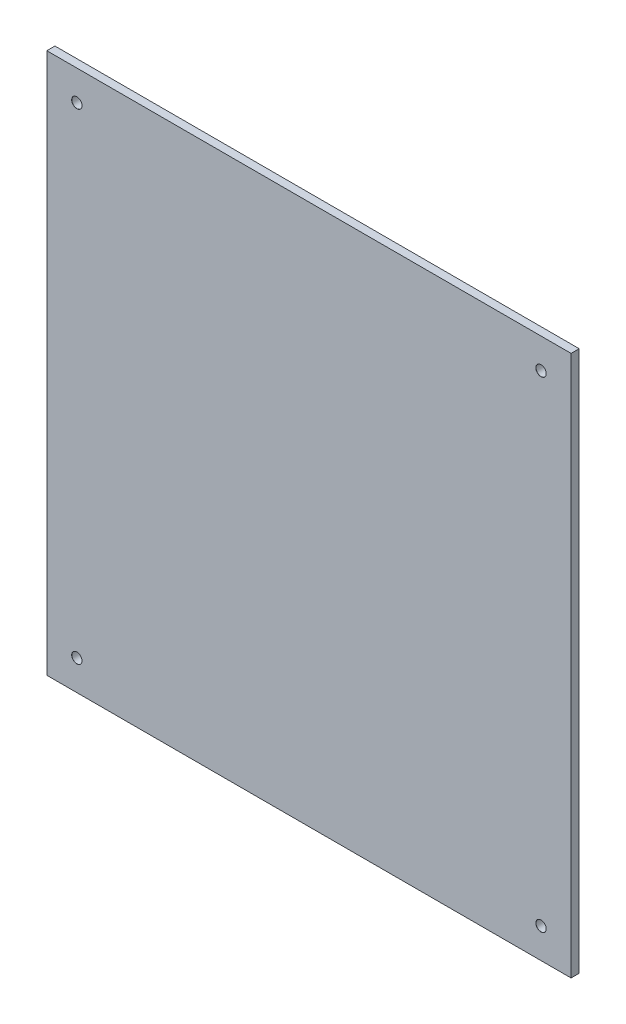
ISO-10303-21;
HEADER;
FILE_DESCRIPTION(('STEP AP214'),'2;1');
FILE_NAME('part.step','',(''),(''),'','','');
FILE_SCHEMA(('AUTOMOTIVE_DESIGN { 1 0 10303 214 1 1 1 1 }'));
ENDSEC;
DATA;
#1=APPLICATION_CONTEXT('core data for automotive mechanical design processes');
#2=APPLICATION_PROTOCOL_DEFINITION('international standard','automotive_design',2000,#1);
#3=PRODUCT_CONTEXT('',#1,'mechanical');
#4=PRODUCT('Part','Part','',(#3));
#5=PRODUCT_RELATED_PRODUCT_CATEGORY('part','',(#4));
#6=PRODUCT_DEFINITION_FORMATION('','',#4);
#7=PRODUCT_DEFINITION_CONTEXT('part definition',#1,'design');
#8=PRODUCT_DEFINITION('design','',#6,#7);
#9=PRODUCT_DEFINITION_SHAPE('','',#8);
#10=(LENGTH_UNIT() NAMED_UNIT(*) SI_UNIT(.MILLI.,.METRE.));
#11=(NAMED_UNIT(*) PLANE_ANGLE_UNIT() SI_UNIT($,.RADIAN.));
#12=(NAMED_UNIT(*) SI_UNIT($,.STERADIAN.) SOLID_ANGLE_UNIT());
#13=UNCERTAINTY_MEASURE_WITH_UNIT(LENGTH_MEASURE(1.E-05),#10,'distance_accuracy_value','');
#14=(GEOMETRIC_REPRESENTATION_CONTEXT(3) GLOBAL_UNCERTAINTY_ASSIGNED_CONTEXT((#13)) GLOBAL_UNIT_ASSIGNED_CONTEXT((#10,
#11,#12)) REPRESENTATION_CONTEXT('',''));
#15=CARTESIAN_POINT('',(0.,0.,0.));
#16=DIRECTION('',(0.,0.,1.));
#17=DIRECTION('',(1.,0.,0.));
#18=AXIS2_PLACEMENT_3D('',#15,#16,#17);
#19=CARTESIAN_POINT('',(250.,9.99999999999998,2.7));
#20=DIRECTION('',(-1.,0.,0.));
#21=DIRECTION('',(0.,0.,1.));
#22=AXIS2_PLACEMENT_3D('',#19,#20,#21);
#23=PLANE('',#22);
#24=DIRECTION('',(0.,1.,0.));
#25=VECTOR('',#24,1.);
#26=CARTESIAN_POINT('',(250.,9.99999999999998,0.));
#27=LINE('',#26,#25);
#28=CARTESIAN_POINT('',(250.,-170.000000000018,0.));
#29=VERTEX_POINT('',#28);
#30=CARTESIAN_POINT('',(250.,9.99999999999998,0.));
#31=VERTEX_POINT('',#30);
#32=EDGE_CURVE('E105',#29,#31,#27,.T.);
#33=ORIENTED_EDGE('',*,*,#32,.T.);
#34=DIRECTION('',(0.,0.,-1.));
#35=VECTOR('',#34,1.);
#36=CARTESIAN_POINT('',(250.,9.99999999999998,2.7));
#37=LINE('',#36,#35);
#38=CARTESIAN_POINT('',(250.,9.99999999999998,2.7));
#39=VERTEX_POINT('',#38);
#40=EDGE_CURVE('E11',#39,#31,#37,.T.);
#41=ORIENTED_EDGE('',*,*,#40,.F.);
#42=DIRECTION('',(0.,1.,0.));
#43=VECTOR('',#42,1.);
#44=CARTESIAN_POINT('',(250.,9.99999999999998,2.7));
#45=LINE('',#44,#43);
#46=CARTESIAN_POINT('',(250.,-170.000000000018,2.7));
#47=VERTEX_POINT('',#46);
#48=EDGE_CURVE('E93',#47,#39,#45,.T.);
#49=ORIENTED_EDGE('',*,*,#48,.F.);
#50=DIRECTION('',(0.,0.,-1.));
#51=VECTOR('',#50,1.);
#52=CARTESIAN_POINT('',(250.,-170.000000000018,2.7));
#53=LINE('',#52,#51);
#54=EDGE_CURVE('E101',#47,#29,#53,.T.);
#55=ORIENTED_EDGE('',*,*,#54,.T.);
#56=EDGE_LOOP('',(#33,#41,#49,#55));
#57=FACE_BOUND('',#56,.T.);
#58=ADVANCED_FACE('F42',(#57),#23,.F.);
#59=CARTESIAN_POINT('',(250.,9.99999999999998,2.7));
#60=DIRECTION('',(0.,-1.,0.));
#61=DIRECTION('',(0.,0.,-1.));
#62=AXIS2_PLACEMENT_3D('',#59,#60,#61);
#63=PLANE('',#62);
#64=DIRECTION('',(-1.,0.,0.));
#65=VECTOR('',#64,1.);
#66=CARTESIAN_POINT('',(250.,9.99999999999998,0.));
#67=LINE('',#66,#65);
#68=CARTESIAN_POINT('',(75.5426678616384,9.99999999999998,0.));
#69=VERTEX_POINT('',#68);
#70=EDGE_CURVE('E97',#31,#69,#67,.T.);
#71=ORIENTED_EDGE('',*,*,#70,.T.);
#72=DIRECTION('',(0.,0.,-1.));
#73=VECTOR('',#72,1.);
#74=CARTESIAN_POINT('',(75.5426678616384,9.99999999999998,2.7));
#75=LINE('',#74,#73);
#76=CARTESIAN_POINT('',(75.5426678616384,9.99999999999998,2.7));
#77=VERTEX_POINT('',#76);
#78=EDGE_CURVE('E50',#77,#69,#75,.T.);
#79=ORIENTED_EDGE('',*,*,#78,.F.);
#80=DIRECTION('',(-1.,0.,0.));
#81=VECTOR('',#80,1.);
#82=CARTESIAN_POINT('',(250.,9.99999999999998,2.7));
#83=LINE('',#82,#81);
#84=EDGE_CURVE('E88',#39,#77,#83,.T.);
#85=ORIENTED_EDGE('',*,*,#84,.F.);
#86=ORIENTED_EDGE('',*,*,#40,.T.);
#87=EDGE_LOOP('',(#71,#79,#85,#86));
#88=FACE_BOUND('',#87,.T.);
#89=ADVANCED_FACE('F96',(#88),#63,.F.);
#90=CARTESIAN_POINT('',(75.5426678616384,9.99999999999998,2.7));
#91=DIRECTION('',(1.,0.,0.));
#92=DIRECTION('',(0.,1.,0.));
#93=AXIS2_PLACEMENT_3D('',#90,#91,#92);
#94=PLANE('',#93);
#95=DIRECTION('',(0.,-1.,0.));
#96=VECTOR('',#95,1.);
#97=CARTESIAN_POINT('',(75.5426678616384,9.99999999999998,0.));
#98=LINE('',#97,#96);
#99=CARTESIAN_POINT('',(75.5426678616384,-170.000000000018,0.));
#100=VERTEX_POINT('',#99);
#101=EDGE_CURVE('E75',#69,#100,#98,.T.);
#102=ORIENTED_EDGE('',*,*,#101,.T.);
#103=DIRECTION('',(0.,0.,-1.));
#104=VECTOR('',#103,1.);
#105=CARTESIAN_POINT('',(75.5426678616384,-170.000000000018,2.7));
#106=LINE('',#105,#104);
#107=CARTESIAN_POINT('',(75.5426678616384,-170.000000000018,2.7));
#108=VERTEX_POINT('',#107);
#109=EDGE_CURVE('E98',#108,#100,#106,.T.);
#110=ORIENTED_EDGE('',*,*,#109,.F.);
#111=DIRECTION('',(0.,-1.,0.));
#112=VECTOR('',#111,1.);
#113=CARTESIAN_POINT('',(75.5426678616384,9.99999999999998,2.7));
#114=LINE('',#113,#112);
#115=EDGE_CURVE('E91',#77,#108,#114,.T.);
#116=ORIENTED_EDGE('',*,*,#115,.F.);
#117=ORIENTED_EDGE('',*,*,#78,.T.);
#118=EDGE_LOOP('',(#102,#110,#116,#117));
#119=FACE_BOUND('',#118,.T.);
#120=ADVANCED_FACE('F99',(#119),#94,.F.);
#121=CARTESIAN_POINT('',(250.,-170.000000000018,2.7));
#122=DIRECTION('',(0.,1.,0.));
#123=DIRECTION('',(0.,0.,1.));
#124=AXIS2_PLACEMENT_3D('',#121,#122,#123);
#125=PLANE('',#124);
#126=DIRECTION('',(1.,0.,0.));
#127=VECTOR('',#126,1.);
#128=CARTESIAN_POINT('',(250.,-170.000000000018,0.));
#129=LINE('',#128,#127);
#130=EDGE_CURVE('E81',#100,#29,#129,.T.);
#131=ORIENTED_EDGE('',*,*,#130,.T.);
#132=ORIENTED_EDGE('',*,*,#54,.F.);
#133=DIRECTION('',(1.,0.,0.));
#134=VECTOR('',#133,1.);
#135=CARTESIAN_POINT('',(250.,-170.000000000018,2.7));
#136=LINE('',#135,#134);
#137=EDGE_CURVE('E58',#108,#47,#136,.T.);
#138=ORIENTED_EDGE('',*,*,#137,.F.);
#139=ORIENTED_EDGE('',*,*,#109,.T.);
#140=EDGE_LOOP('',(#131,#132,#138,#139));
#141=FACE_BOUND('',#140,.T.);
#142=ADVANCED_FACE('F113',(#141),#125,.F.);
#143=CARTESIAN_POINT('',(0.,0.,2.7));
#144=DIRECTION('',(0.,0.,-1.));
#145=DIRECTION('',(-1.,0.,0.));
#146=AXIS2_PLACEMENT_3D('',#143,#144,#145);
#147=PLANE('',#146);
#148=CARTESIAN_POINT('',(85.5426678616384,0.,2.7));
#149=DIRECTION('',(0.,0.,1.));
#150=DIRECTION('',(1.,0.,0.));
#151=AXIS2_PLACEMENT_3D('',#148,#149,#150);
#152=CIRCLE('',#151,1.725);
#153=CARTESIAN_POINT('',(87.2676678616384,0.,2.7));
#154=VERTEX_POINT('',#153);
#155=EDGE_CURVE('E151',#154,#154,#152,.T.);
#156=ORIENTED_EDGE('',*,*,#155,.F.);
#157=EDGE_LOOP('',(#156));
#158=FACE_BOUND('',#157,.T.);
#159=CARTESIAN_POINT('',(85.5426678616384,-160.000000000018,2.7));
#160=DIRECTION('',(0.,0.,1.));
#161=DIRECTION('',(1.,0.,0.));
#162=AXIS2_PLACEMENT_3D('',#159,#160,#161);
#163=CIRCLE('',#162,1.725);
#164=CARTESIAN_POINT('',(87.2676678616384,-160.000000000018,2.7));
#165=VERTEX_POINT('',#164);
#166=EDGE_CURVE('E142',#165,#165,#163,.T.);
#167=ORIENTED_EDGE('',*,*,#166,.F.);
#168=EDGE_LOOP('',(#167));
#169=FACE_BOUND('',#168,.T.);
#170=CARTESIAN_POINT('',(240.,-160.000000000018,2.7));
#171=DIRECTION('',(0.,0.,1.));
#172=DIRECTION('',(1.,0.,0.));
#173=AXIS2_PLACEMENT_3D('',#170,#171,#172);
#174=CIRCLE('',#173,1.725);
#175=CARTESIAN_POINT('',(241.725,-160.000000000018,2.7));
#176=VERTEX_POINT('',#175);
#177=EDGE_CURVE('E133',#176,#176,#174,.T.);
#178=ORIENTED_EDGE('',*,*,#177,.F.);
#179=EDGE_LOOP('',(#178));
#180=FACE_BOUND('',#179,.T.);
#181=CARTESIAN_POINT('',(240.,0.,2.7));
#182=DIRECTION('',(0.,0.,1.));
#183=DIRECTION('',(1.,0.,0.));
#184=AXIS2_PLACEMENT_3D('',#181,#182,#183);
#185=CIRCLE('',#184,1.725);
#186=CARTESIAN_POINT('',(241.725,0.,2.7));
#187=VERTEX_POINT('',#186);
#188=EDGE_CURVE('E124',#187,#187,#185,.T.);
#189=ORIENTED_EDGE('',*,*,#188,.F.);
#190=EDGE_LOOP('',(#189));
#191=FACE_BOUND('',#190,.T.);
#192=ORIENTED_EDGE('',*,*,#48,.T.);
#193=ORIENTED_EDGE('',*,*,#84,.T.);
#194=ORIENTED_EDGE('',*,*,#115,.T.);
#195=ORIENTED_EDGE('',*,*,#137,.T.);
#196=EDGE_LOOP('',(#192,#193,#194,#195));
#197=FACE_BOUND('',#196,.T.);
#198=ADVANCED_FACE('F89',(#158,#169,#180,#191,#197),#147,.F.);
#199=CARTESIAN_POINT('',(0.,0.,0.));
#200=DIRECTION('',(0.,0.,-1.));
#201=DIRECTION('',(-1.,0.,0.));
#202=AXIS2_PLACEMENT_3D('',#199,#200,#201);
#203=PLANE('',#202);
#204=CARTESIAN_POINT('',(85.5426678616384,0.,0.));
#205=DIRECTION('',(0.,0.,1.));
#206=DIRECTION('',(1.,0.,0.));
#207=AXIS2_PLACEMENT_3D('',#204,#205,#206);
#208=CIRCLE('',#207,1.69999999999999);
#209=CARTESIAN_POINT('',(87.2426678616384,0.,0.));
#210=VERTEX_POINT('',#209);
#211=EDGE_CURVE('E145',#210,#210,#208,.T.);
#212=ORIENTED_EDGE('',*,*,#211,.T.);
#213=EDGE_LOOP('',(#212));
#214=FACE_BOUND('',#213,.T.);
#215=CARTESIAN_POINT('',(85.5426678616384,-160.000000000018,0.));
#216=DIRECTION('',(0.,0.,1.));
#217=DIRECTION('',(1.,0.,0.));
#218=AXIS2_PLACEMENT_3D('',#215,#216,#217);
#219=CIRCLE('',#218,1.69999999999999);
#220=CARTESIAN_POINT('',(87.2426678616384,-160.000000000018,0.));
#221=VERTEX_POINT('',#220);
#222=EDGE_CURVE('E136',#221,#221,#219,.T.);
#223=ORIENTED_EDGE('',*,*,#222,.T.);
#224=EDGE_LOOP('',(#223));
#225=FACE_BOUND('',#224,.T.);
#226=CARTESIAN_POINT('',(240.,-160.000000000018,0.));
#227=DIRECTION('',(0.,0.,1.));
#228=DIRECTION('',(1.,0.,0.));
#229=AXIS2_PLACEMENT_3D('',#226,#227,#228);
#230=CIRCLE('',#229,1.70000000000001);
#231=CARTESIAN_POINT('',(241.7,-160.000000000018,0.));
#232=VERTEX_POINT('',#231);
#233=EDGE_CURVE('E127',#232,#232,#230,.T.);
#234=ORIENTED_EDGE('',*,*,#233,.T.);
#235=EDGE_LOOP('',(#234));
#236=FACE_BOUND('',#235,.T.);
#237=CARTESIAN_POINT('',(240.,0.,0.));
#238=DIRECTION('',(0.,0.,1.));
#239=DIRECTION('',(1.,0.,0.));
#240=AXIS2_PLACEMENT_3D('',#237,#238,#239);
#241=CIRCLE('',#240,1.70000000000001);
#242=CARTESIAN_POINT('',(241.7,0.,0.));
#243=VERTEX_POINT('',#242);
#244=EDGE_CURVE('E108',#243,#243,#241,.T.);
#245=ORIENTED_EDGE('',*,*,#244,.T.);
#246=EDGE_LOOP('',(#245));
#247=FACE_BOUND('',#246,.T.);
#248=ORIENTED_EDGE('',*,*,#32,.F.);
#249=ORIENTED_EDGE('',*,*,#130,.F.);
#250=ORIENTED_EDGE('',*,*,#101,.F.);
#251=ORIENTED_EDGE('',*,*,#70,.F.);
#252=EDGE_LOOP('',(#248,#249,#250,#251));
#253=FACE_BOUND('',#252,.T.);
#254=ADVANCED_FACE('F116',(#214,#225,#236,#247,#253),#203,.T.);
#255=CARTESIAN_POINT('',(240.,0.,2.7));
#256=DIRECTION('',(0.,0.,1.));
#257=DIRECTION('',(1.,0.,0.));
#258=AXIS2_PLACEMENT_3D('',#255,#256,#257);
#259=CYLINDRICAL_SURFACE('',#258,1.70000000000001);
#260=ORIENTED_EDGE('',*,*,#244,.F.);
#261=EDGE_LOOP('',(#260));
#262=FACE_BOUND('',#261,.T.);
#263=CARTESIAN_POINT('',(240.,0.,2.675));
#264=DIRECTION('',(0.,0.,1.));
#265=DIRECTION('',(1.,0.,0.));
#266=AXIS2_PLACEMENT_3D('',#263,#264,#265);
#267=CIRCLE('',#266,1.70000000000001);
#268=CARTESIAN_POINT('',(241.7,0.,2.675));
#269=VERTEX_POINT('',#268);
#270=EDGE_CURVE('E121',#269,#269,#267,.T.);
#271=ORIENTED_EDGE('',*,*,#270,.T.);
#272=EDGE_LOOP('',(#271));
#273=FACE_BOUND('',#272,.T.);
#274=ADVANCED_FACE('F169',(#262,#273),#259,.F.);
#275=CARTESIAN_POINT('',(240.,0.,2.7));
#276=DIRECTION('',(0.,0.,1.));
#277=DIRECTION('',(1.,0.,0.));
#278=AXIS2_PLACEMENT_3D('',#275,#276,#277);
#279=CONICAL_SURFACE('',#278,1.725,0.785398163397344);
#280=ORIENTED_EDGE('',*,*,#270,.F.);
#281=EDGE_LOOP('',(#280));
#282=FACE_BOUND('',#281,.T.);
#283=ORIENTED_EDGE('',*,*,#188,.T.);
#284=EDGE_LOOP('',(#283));
#285=FACE_BOUND('',#284,.T.);
#286=ADVANCED_FACE('F166',(#282,#285),#279,.F.);
#287=CARTESIAN_POINT('',(240.,-160.000000000018,2.7));
#288=DIRECTION('',(0.,0.,1.));
#289=DIRECTION('',(1.,0.,0.));
#290=AXIS2_PLACEMENT_3D('',#287,#288,#289);
#291=CYLINDRICAL_SURFACE('',#290,1.70000000000001);
#292=ORIENTED_EDGE('',*,*,#233,.F.);
#293=EDGE_LOOP('',(#292));
#294=FACE_BOUND('',#293,.T.);
#295=CARTESIAN_POINT('',(240.,-160.000000000018,2.675));
#296=DIRECTION('',(0.,0.,1.));
#297=DIRECTION('',(1.,0.,0.));
#298=AXIS2_PLACEMENT_3D('',#295,#296,#297);
#299=CIRCLE('',#298,1.70000000000001);
#300=CARTESIAN_POINT('',(241.7,-160.000000000018,2.675));
#301=VERTEX_POINT('',#300);
#302=EDGE_CURVE('E130',#301,#301,#299,.T.);
#303=ORIENTED_EDGE('',*,*,#302,.T.);
#304=EDGE_LOOP('',(#303));
#305=FACE_BOUND('',#304,.T.);
#306=ADVANCED_FACE('F168',(#294,#305),#291,.F.);
#307=CARTESIAN_POINT('',(240.,-160.000000000018,2.7));
#308=DIRECTION('',(0.,0.,1.));
#309=DIRECTION('',(1.,0.,0.));
#310=AXIS2_PLACEMENT_3D('',#307,#308,#309);
#311=CONICAL_SURFACE('',#310,1.725,0.785398163397344);
#312=ORIENTED_EDGE('',*,*,#302,.F.);
#313=EDGE_LOOP('',(#312));
#314=FACE_BOUND('',#313,.T.);
#315=ORIENTED_EDGE('',*,*,#177,.T.);
#316=EDGE_LOOP('',(#315));
#317=FACE_BOUND('',#316,.T.);
#318=ADVANCED_FACE('F176',(#314,#317),#311,.F.);
#319=CARTESIAN_POINT('',(85.5426678616384,-160.000000000018,2.7));
#320=DIRECTION('',(0.,0.,1.));
#321=DIRECTION('',(1.,0.,0.));
#322=AXIS2_PLACEMENT_3D('',#319,#320,#321);
#323=CYLINDRICAL_SURFACE('',#322,1.69999999999999);
#324=ORIENTED_EDGE('',*,*,#222,.F.);
#325=EDGE_LOOP('',(#324));
#326=FACE_BOUND('',#325,.T.);
#327=CARTESIAN_POINT('',(85.5426678616384,-160.000000000018,2.675));
#328=DIRECTION('',(0.,0.,1.));
#329=DIRECTION('',(1.,0.,0.));
#330=AXIS2_PLACEMENT_3D('',#327,#328,#329);
#331=CIRCLE('',#330,1.69999999999999);
#332=CARTESIAN_POINT('',(87.2426678616384,-160.000000000018,2.675));
#333=VERTEX_POINT('',#332);
#334=EDGE_CURVE('E139',#333,#333,#331,.T.);
#335=ORIENTED_EDGE('',*,*,#334,.T.);
#336=EDGE_LOOP('',(#335));
#337=FACE_BOUND('',#336,.T.);
#338=ADVANCED_FACE('F211',(#326,#337),#323,.F.);
#339=CARTESIAN_POINT('',(85.5426678616384,-160.000000000018,2.7));
#340=DIRECTION('',(0.,0.,1.));
#341=DIRECTION('',(1.,0.,0.));
#342=AXIS2_PLACEMENT_3D('',#339,#340,#341);
#343=CONICAL_SURFACE('',#342,1.725,0.785398163397622);
#344=ORIENTED_EDGE('',*,*,#334,.F.);
#345=EDGE_LOOP('',(#344));
#346=FACE_BOUND('',#345,.T.);
#347=ORIENTED_EDGE('',*,*,#166,.T.);
#348=EDGE_LOOP('',(#347));
#349=FACE_BOUND('',#348,.T.);
#350=ADVANCED_FACE('F216',(#346,#349),#343,.F.);
#351=CARTESIAN_POINT('',(85.5426678616384,0.,2.7));
#352=DIRECTION('',(0.,0.,1.));
#353=DIRECTION('',(1.,0.,0.));
#354=AXIS2_PLACEMENT_3D('',#351,#352,#353);
#355=CYLINDRICAL_SURFACE('',#354,1.69999999999999);
#356=ORIENTED_EDGE('',*,*,#211,.F.);
#357=EDGE_LOOP('',(#356));
#358=FACE_BOUND('',#357,.T.);
#359=CARTESIAN_POINT('',(85.5426678616384,0.,2.675));
#360=DIRECTION('',(0.,0.,1.));
#361=DIRECTION('',(1.,0.,0.));
#362=AXIS2_PLACEMENT_3D('',#359,#360,#361);
#363=CIRCLE('',#362,1.69999999999999);
#364=CARTESIAN_POINT('',(87.2426678616384,0.,2.675));
#365=VERTEX_POINT('',#364);
#366=EDGE_CURVE('E148',#365,#365,#363,.T.);
#367=ORIENTED_EDGE('',*,*,#366,.T.);
#368=EDGE_LOOP('',(#367));
#369=FACE_BOUND('',#368,.T.);
#370=ADVANCED_FACE('F222',(#358,#369),#355,.F.);
#371=CARTESIAN_POINT('',(85.5426678616384,0.,2.7));
#372=DIRECTION('',(0.,0.,1.));
#373=DIRECTION('',(1.,0.,0.));
#374=AXIS2_PLACEMENT_3D('',#371,#372,#373);
#375=CONICAL_SURFACE('',#374,1.725,0.785398163397622);
#376=ORIENTED_EDGE('',*,*,#366,.F.);
#377=EDGE_LOOP('',(#376));
#378=FACE_BOUND('',#377,.T.);
#379=ORIENTED_EDGE('',*,*,#155,.T.);
#380=EDGE_LOOP('',(#379));
#381=FACE_BOUND('',#380,.T.);
#382=ADVANCED_FACE('F155',(#378,#381),#375,.F.);
#383=CLOSED_SHELL('',(#58,#89,#120,#142,#198,#254,#274,#286,#306,#318,#338,#350,#370,#382));
#384=MANIFOLD_SOLID_BREP('B2',#383);
#385=ADVANCED_BREP_SHAPE_REPRESENTATION('',(#18,#384),#14);
#386=SHAPE_DEFINITION_REPRESENTATION(#9,#385);
ENDSEC;
END-ISO-10303-21;
